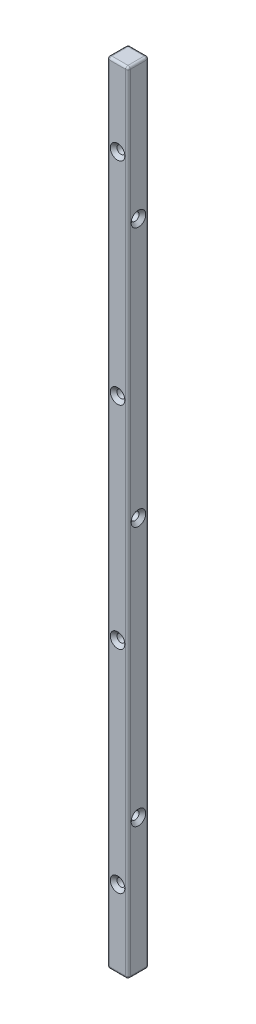
ISO-10303-21;
HEADER;
FILE_DESCRIPTION(('STEP AP214'),'2;1');
FILE_NAME('part.step','',(''),(''),'','','');
FILE_SCHEMA(('AUTOMOTIVE_DESIGN { 1 0 10303 214 1 1 1 1 }'));
ENDSEC;
DATA;
#1=APPLICATION_CONTEXT('core data for automotive mechanical design processes');
#2=APPLICATION_PROTOCOL_DEFINITION('international standard','automotive_design',2000,#1);
#3=PRODUCT_CONTEXT('',#1,'mechanical');
#4=PRODUCT('Part','Part','',(#3));
#5=PRODUCT_RELATED_PRODUCT_CATEGORY('part','',(#4));
#6=PRODUCT_DEFINITION_FORMATION('','',#4);
#7=PRODUCT_DEFINITION_CONTEXT('part definition',#1,'design');
#8=PRODUCT_DEFINITION('design','',#6,#7);
#9=PRODUCT_DEFINITION_SHAPE('','',#8);
#10=(LENGTH_UNIT() NAMED_UNIT(*) SI_UNIT(.MILLI.,.METRE.));
#11=(NAMED_UNIT(*) PLANE_ANGLE_UNIT() SI_UNIT($,.RADIAN.));
#12=(NAMED_UNIT(*) SI_UNIT($,.STERADIAN.) SOLID_ANGLE_UNIT());
#13=UNCERTAINTY_MEASURE_WITH_UNIT(LENGTH_MEASURE(1.E-05),#10,'distance_accuracy_value','');
#14=(GEOMETRIC_REPRESENTATION_CONTEXT(3) GLOBAL_UNCERTAINTY_ASSIGNED_CONTEXT((#13)) GLOBAL_UNIT_ASSIGNED_CONTEXT((#10,
#11,#12)) REPRESENTATION_CONTEXT('',''));
#15=CARTESIAN_POINT('',(0.,0.,0.));
#16=DIRECTION('',(0.,0.,1.));
#17=DIRECTION('',(1.,0.,0.));
#18=AXIS2_PLACEMENT_3D('',#15,#16,#17);
#19=CARTESIAN_POINT('',(4.5,340.5,4.5));
#20=DIRECTION('',(-1.,0.,0.));
#21=DIRECTION('',(0.,0.,1.));
#22=AXIS2_PLACEMENT_3D('',#19,#20,#21);
#23=PLANE('',#22);
#24=CARTESIAN_POINT('',(4.5,58.5,0.));
#25=DIRECTION('',(1.,0.,0.));
#26=DIRECTION('',(0.,0.,-1.));
#27=AXIS2_PLACEMENT_3D('',#24,#25,#26);
#28=CIRCLE('',#27,3.15);
#29=CARTESIAN_POINT('',(4.5,58.5,-3.15));
#30=VERTEX_POINT('',#29);
#31=EDGE_CURVE('E771',#30,#30,#28,.T.);
#32=ORIENTED_EDGE('',*,*,#31,.F.);
#33=EDGE_LOOP('',(#32));
#34=FACE_BOUND('',#33,.T.);
#35=CARTESIAN_POINT('',(4.5,170.25,0.));
#36=DIRECTION('',(1.,0.,0.));
#37=DIRECTION('',(0.,0.,-1.));
#38=AXIS2_PLACEMENT_3D('',#35,#36,#37);
#39=CIRCLE('',#38,3.14999999999999);
#40=CARTESIAN_POINT('',(4.5,170.25,-3.14999999999999));
#41=VERTEX_POINT('',#40);
#42=EDGE_CURVE('E764',#41,#41,#39,.T.);
#43=ORIENTED_EDGE('',*,*,#42,.F.);
#44=EDGE_LOOP('',(#43));
#45=FACE_BOUND('',#44,.T.);
#46=CARTESIAN_POINT('',(4.5,282.,0.));
#47=DIRECTION('',(1.,0.,0.));
#48=DIRECTION('',(0.,0.,-1.));
#49=AXIS2_PLACEMENT_3D('',#46,#47,#48);
#50=CIRCLE('',#49,3.14999999999999);
#51=CARTESIAN_POINT('',(4.5,282.,-3.14999999999999));
#52=VERTEX_POINT('',#51);
#53=EDGE_CURVE('E698',#52,#52,#50,.T.);
#54=ORIENTED_EDGE('',*,*,#53,.F.);
#55=EDGE_LOOP('',(#54));
#56=FACE_BOUND('',#55,.T.);
#57=DIRECTION('',(0.,-1.,0.));
#58=VECTOR('',#57,1.);
#59=CARTESIAN_POINT('',(4.5,340.5,-3.5));
#60=LINE('',#59,#58);
#61=CARTESIAN_POINT('',(4.5,1.,-3.5));
#62=VERTEX_POINT('',#61);
#63=CARTESIAN_POINT('',(4.5,339.5,-3.5));
#64=VERTEX_POINT('',#63);
#65=EDGE_CURVE('E131',#62,#64,#60,.F.);
#66=ORIENTED_EDGE('',*,*,#65,.T.);
#67=DIRECTION('',(0.,0.,-1.));
#68=VECTOR('',#67,1.);
#69=CARTESIAN_POINT('',(4.5,339.5,4.5));
#70=LINE('',#69,#68);
#71=CARTESIAN_POINT('',(4.5,339.5,3.5));
#72=VERTEX_POINT('',#71);
#73=EDGE_CURVE('E169',#64,#72,#70,.F.);
#74=ORIENTED_EDGE('',*,*,#73,.T.);
#75=DIRECTION('',(0.,-1.,0.));
#76=VECTOR('',#75,1.);
#77=CARTESIAN_POINT('',(4.5,340.5,3.5));
#78=LINE('',#77,#76);
#79=CARTESIAN_POINT('',(4.5,1.,3.5));
#80=VERTEX_POINT('',#79);
#81=EDGE_CURVE('E166',#72,#80,#78,.T.);
#82=ORIENTED_EDGE('',*,*,#81,.T.);
#83=DIRECTION('',(0.,0.,-1.));
#84=VECTOR('',#83,1.);
#85=CARTESIAN_POINT('',(4.5,1.,-4.5));
#86=LINE('',#85,#84);
#87=EDGE_CURVE('E161',#80,#62,#86,.T.);
#88=ORIENTED_EDGE('',*,*,#87,.T.);
#89=EDGE_LOOP('',(#66,#74,#82,#88));
#90=FACE_BOUND('',#89,.T.);
#91=ADVANCED_FACE('F36',(#34,#45,#56,#90),#23,.F.);
#92=CARTESIAN_POINT('',(-4.5,340.5,-4.5));
#93=DIRECTION('',(0.,0.,1.));
#94=DIRECTION('',(1.,0.,0.));
#95=AXIS2_PLACEMENT_3D('',#92,#93,#94);
#96=PLANE('',#95);
#97=CARTESIAN_POINT('',(0.,307.,-4.5));
#98=DIRECTION('',(0.,0.,1.));
#99=DIRECTION('',(1.,0.,0.));
#100=AXIS2_PLACEMENT_3D('',#97,#98,#99);
#101=CIRCLE('',#100,1.7);
#102=CARTESIAN_POINT('',(1.7,307.,-4.5));
#103=VERTEX_POINT('',#102);
#104=EDGE_CURVE('E704',#103,#103,#101,.T.);
#105=ORIENTED_EDGE('',*,*,#104,.T.);
#106=EDGE_LOOP('',(#105));
#107=FACE_BOUND('',#106,.T.);
#108=CARTESIAN_POINT('',(0.,215.833333333333,-4.5));
#109=DIRECTION('',(0.,0.,1.));
#110=DIRECTION('',(1.,0.,0.));
#111=AXIS2_PLACEMENT_3D('',#108,#109,#110);
#112=CIRCLE('',#111,1.7);
#113=CARTESIAN_POINT('',(1.7,215.833333333333,-4.5));
#114=VERTEX_POINT('',#113);
#115=EDGE_CURVE('E713',#114,#114,#112,.T.);
#116=ORIENTED_EDGE('',*,*,#115,.T.);
#117=EDGE_LOOP('',(#116));
#118=FACE_BOUND('',#117,.T.);
#119=CARTESIAN_POINT('',(0.,124.666666666667,-4.5));
#120=DIRECTION('',(0.,0.,1.));
#121=DIRECTION('',(1.,0.,0.));
#122=AXIS2_PLACEMENT_3D('',#119,#120,#121);
#123=CIRCLE('',#122,1.7);
#124=CARTESIAN_POINT('',(1.7,124.666666666667,-4.5));
#125=VERTEX_POINT('',#124);
#126=EDGE_CURVE('E722',#125,#125,#123,.T.);
#127=ORIENTED_EDGE('',*,*,#126,.T.);
#128=EDGE_LOOP('',(#127));
#129=FACE_BOUND('',#128,.T.);
#130=CARTESIAN_POINT('',(0.,33.5,-4.5));
#131=DIRECTION('',(0.,0.,1.));
#132=DIRECTION('',(1.,0.,0.));
#133=AXIS2_PLACEMENT_3D('',#130,#131,#132);
#134=CIRCLE('',#133,1.7);
#135=CARTESIAN_POINT('',(1.7,33.5,-4.5));
#136=VERTEX_POINT('',#135);
#137=EDGE_CURVE('E135',#136,#136,#134,.T.);
#138=ORIENTED_EDGE('',*,*,#137,.T.);
#139=EDGE_LOOP('',(#138));
#140=FACE_BOUND('',#139,.T.);
#141=DIRECTION('',(0.,-1.,0.));
#142=VECTOR('',#141,1.);
#143=CARTESIAN_POINT('',(-3.5,340.5,-4.5));
#144=LINE('',#143,#142);
#145=CARTESIAN_POINT('',(-3.5,1.,-4.5));
#146=VERTEX_POINT('',#145);
#147=CARTESIAN_POINT('',(-3.5,339.5,-4.5));
#148=VERTEX_POINT('',#147);
#149=EDGE_CURVE('E154',#146,#148,#144,.F.);
#150=ORIENTED_EDGE('',*,*,#149,.T.);
#151=DIRECTION('',(-1.,0.,0.));
#152=VECTOR('',#151,1.);
#153=CARTESIAN_POINT('',(-4.5,339.5,-4.5));
#154=LINE('',#153,#152);
#155=CARTESIAN_POINT('',(3.5,339.5,-4.5));
#156=VERTEX_POINT('',#155);
#157=EDGE_CURVE('E158',#148,#156,#154,.F.);
#158=ORIENTED_EDGE('',*,*,#157,.T.);
#159=DIRECTION('',(0.,-1.,0.));
#160=VECTOR('',#159,1.);
#161=CARTESIAN_POINT('',(3.5,340.5,-4.5));
#162=LINE('',#161,#160);
#163=CARTESIAN_POINT('',(3.5,1.,-4.5));
#164=VERTEX_POINT('',#163);
#165=EDGE_CURVE('E129',#156,#164,#162,.T.);
#166=ORIENTED_EDGE('',*,*,#165,.T.);
#167=DIRECTION('',(-1.,0.,0.));
#168=VECTOR('',#167,1.);
#169=CARTESIAN_POINT('',(-4.5,1.,-4.5));
#170=LINE('',#169,#168);
#171=EDGE_CURVE('E148',#164,#146,#170,.T.);
#172=ORIENTED_EDGE('',*,*,#171,.T.);
#173=EDGE_LOOP('',(#150,#158,#166,#172));
#174=FACE_BOUND('',#173,.T.);
#175=ADVANCED_FACE('F156',(#107,#118,#129,#140,#174),#96,.F.);
#176=CARTESIAN_POINT('',(-4.5,340.5,4.5));
#177=DIRECTION('',(1.,0.,0.));
#178=DIRECTION('',(0.,0.,-1.));
#179=AXIS2_PLACEMENT_3D('',#176,#177,#178);
#180=PLANE('',#179);
#181=CARTESIAN_POINT('',(-4.5,58.5,0.));
#182=DIRECTION('',(1.,0.,0.));
#183=DIRECTION('',(0.,0.,-1.));
#184=AXIS2_PLACEMENT_3D('',#181,#182,#183);
#185=CIRCLE('',#184,1.7);
#186=CARTESIAN_POINT('',(-4.5,58.5,-1.7));
#187=VERTEX_POINT('',#186);
#188=EDGE_CURVE('E683',#187,#187,#185,.T.);
#189=ORIENTED_EDGE('',*,*,#188,.T.);
#190=EDGE_LOOP('',(#189));
#191=FACE_BOUND('',#190,.T.);
#192=CARTESIAN_POINT('',(-4.5,170.25,0.));
#193=DIRECTION('',(1.,0.,0.));
#194=DIRECTION('',(0.,0.,-1.));
#195=AXIS2_PLACEMENT_3D('',#192,#193,#194);
#196=CIRCLE('',#195,1.70000000000001);
#197=CARTESIAN_POINT('',(-4.5,170.25,-1.70000000000001));
#198=VERTEX_POINT('',#197);
#199=EDGE_CURVE('E687',#198,#198,#196,.T.);
#200=ORIENTED_EDGE('',*,*,#199,.T.);
#201=EDGE_LOOP('',(#200));
#202=FACE_BOUND('',#201,.T.);
#203=CARTESIAN_POINT('',(-4.5,282.,0.));
#204=DIRECTION('',(1.,0.,0.));
#205=DIRECTION('',(0.,0.,-1.));
#206=AXIS2_PLACEMENT_3D('',#203,#204,#205);
#207=CIRCLE('',#206,1.69999999999998);
#208=CARTESIAN_POINT('',(-4.5,282.,-1.69999999999998));
#209=VERTEX_POINT('',#208);
#210=EDGE_CURVE('E690',#209,#209,#207,.T.);
#211=ORIENTED_EDGE('',*,*,#210,.T.);
#212=EDGE_LOOP('',(#211));
#213=FACE_BOUND('',#212,.T.);
#214=DIRECTION('',(0.,-1.,0.));
#215=VECTOR('',#214,1.);
#216=CARTESIAN_POINT('',(-4.5,340.5,3.5));
#217=LINE('',#216,#215);
#218=CARTESIAN_POINT('',(-4.5,1.,3.5));
#219=VERTEX_POINT('',#218);
#220=CARTESIAN_POINT('',(-4.5,339.5,3.5));
#221=VERTEX_POINT('',#220);
#222=EDGE_CURVE('E173',#219,#221,#217,.F.);
#223=ORIENTED_EDGE('',*,*,#222,.T.);
#224=DIRECTION('',(0.,0.,1.));
#225=VECTOR('',#224,1.);
#226=CARTESIAN_POINT('',(-4.5,339.5,4.5));
#227=LINE('',#226,#225);
#228=CARTESIAN_POINT('',(-4.5,339.5,-3.5));
#229=VERTEX_POINT('',#228);
#230=EDGE_CURVE('E178',#221,#229,#227,.F.);
#231=ORIENTED_EDGE('',*,*,#230,.T.);
#232=DIRECTION('',(0.,-1.,0.));
#233=VECTOR('',#232,1.);
#234=CARTESIAN_POINT('',(-4.5,340.5,-3.5));
#235=LINE('',#234,#233);
#236=CARTESIAN_POINT('',(-4.5,1.,-3.5));
#237=VERTEX_POINT('',#236);
#238=EDGE_CURVE('E175',#229,#237,#235,.T.);
#239=ORIENTED_EDGE('',*,*,#238,.T.);
#240=DIRECTION('',(0.,0.,1.));
#241=VECTOR('',#240,1.);
#242=CARTESIAN_POINT('',(-4.5,1.,4.5));
#243=LINE('',#242,#241);
#244=EDGE_CURVE('E171',#237,#219,#243,.T.);
#245=ORIENTED_EDGE('',*,*,#244,.T.);
#246=EDGE_LOOP('',(#223,#231,#239,#245));
#247=FACE_BOUND('',#246,.T.);
#248=ADVANCED_FACE('F283',(#191,#202,#213,#247),#180,.F.);
#249=CARTESIAN_POINT('',(-4.5,340.5,4.5));
#250=DIRECTION('',(0.,0.,-1.));
#251=DIRECTION('',(-1.,0.,0.));
#252=AXIS2_PLACEMENT_3D('',#249,#250,#251);
#253=PLANE('',#252);
#254=CARTESIAN_POINT('',(0.,307.,4.5));
#255=DIRECTION('',(0.,0.,1.));
#256=DIRECTION('',(1.,0.,0.));
#257=AXIS2_PLACEMENT_3D('',#254,#255,#256);
#258=CIRCLE('',#257,3.15);
#259=CARTESIAN_POINT('',(3.15,307.,4.5));
#260=VERTEX_POINT('',#259);
#261=EDGE_CURVE('E691',#260,#260,#258,.T.);
#262=ORIENTED_EDGE('',*,*,#261,.F.);
#263=EDGE_LOOP('',(#262));
#264=FACE_BOUND('',#263,.T.);
#265=CARTESIAN_POINT('',(0.,215.833333333333,4.5));
#266=DIRECTION('',(0.,0.,1.));
#267=DIRECTION('',(1.,0.,0.));
#268=AXIS2_PLACEMENT_3D('',#265,#266,#267);
#269=CIRCLE('',#268,3.15);
#270=CARTESIAN_POINT('',(3.15,215.833333333333,4.5));
#271=VERTEX_POINT('',#270);
#272=EDGE_CURVE('E707',#271,#271,#269,.T.);
#273=ORIENTED_EDGE('',*,*,#272,.F.);
#274=EDGE_LOOP('',(#273));
#275=FACE_BOUND('',#274,.T.);
#276=CARTESIAN_POINT('',(0.,124.666666666667,4.5));
#277=DIRECTION('',(0.,0.,1.));
#278=DIRECTION('',(1.,0.,0.));
#279=AXIS2_PLACEMENT_3D('',#276,#277,#278);
#280=CIRCLE('',#279,3.15);
#281=CARTESIAN_POINT('',(3.15,124.666666666667,4.5));
#282=VERTEX_POINT('',#281);
#283=EDGE_CURVE('E716',#282,#282,#280,.T.);
#284=ORIENTED_EDGE('',*,*,#283,.F.);
#285=EDGE_LOOP('',(#284));
#286=FACE_BOUND('',#285,.T.);
#287=CARTESIAN_POINT('',(0.,33.5,4.5));
#288=DIRECTION('',(0.,0.,1.));
#289=DIRECTION('',(1.,0.,0.));
#290=AXIS2_PLACEMENT_3D('',#287,#288,#289);
#291=CIRCLE('',#290,3.15);
#292=CARTESIAN_POINT('',(3.15,33.5,4.5));
#293=VERTEX_POINT('',#292);
#294=EDGE_CURVE('E725',#293,#293,#291,.T.);
#295=ORIENTED_EDGE('',*,*,#294,.F.);
#296=EDGE_LOOP('',(#295));
#297=FACE_BOUND('',#296,.T.);
#298=DIRECTION('',(0.,-1.,0.));
#299=VECTOR('',#298,1.);
#300=CARTESIAN_POINT('',(3.5,340.5,4.5));
#301=LINE('',#300,#299);
#302=CARTESIAN_POINT('',(3.5,1.,4.5));
#303=VERTEX_POINT('',#302);
#304=CARTESIAN_POINT('',(3.5,339.5,4.5));
#305=VERTEX_POINT('',#304);
#306=EDGE_CURVE('E182',#303,#305,#301,.F.);
#307=ORIENTED_EDGE('',*,*,#306,.T.);
#308=DIRECTION('',(1.,0.,0.));
#309=VECTOR('',#308,1.);
#310=CARTESIAN_POINT('',(-4.5,339.5,4.5));
#311=LINE('',#310,#309);
#312=CARTESIAN_POINT('',(-3.5,339.5,4.5));
#313=VERTEX_POINT('',#312);
#314=EDGE_CURVE('E187',#305,#313,#311,.F.);
#315=ORIENTED_EDGE('',*,*,#314,.T.);
#316=DIRECTION('',(0.,-1.,0.));
#317=VECTOR('',#316,1.);
#318=CARTESIAN_POINT('',(-3.5,340.5,4.5));
#319=LINE('',#318,#317);
#320=CARTESIAN_POINT('',(-3.5,1.,4.5));
#321=VERTEX_POINT('',#320);
#322=EDGE_CURVE('E184',#313,#321,#319,.T.);
#323=ORIENTED_EDGE('',*,*,#322,.T.);
#324=DIRECTION('',(1.,0.,0.));
#325=VECTOR('',#324,1.);
#326=CARTESIAN_POINT('',(4.5,1.,4.5));
#327=LINE('',#326,#325);
#328=EDGE_CURVE('E180',#321,#303,#327,.T.);
#329=ORIENTED_EDGE('',*,*,#328,.T.);
#330=EDGE_LOOP('',(#307,#315,#323,#329));
#331=FACE_BOUND('',#330,.T.);
#332=ADVANCED_FACE('F293',(#264,#275,#286,#297,#331),#253,.F.);
#333=CARTESIAN_POINT('',(4.5,340.5,-4.5));
#334=DIRECTION('',(0.,-1.,0.));
#335=DIRECTION('',(0.,0.,-1.));
#336=AXIS2_PLACEMENT_3D('',#333,#334,#335);
#337=PLANE('',#336);
#338=DIRECTION('',(0.,0.,1.));
#339=VECTOR('',#338,1.);
#340=CARTESIAN_POINT('',(-3.5,340.5,-4.5));
#341=LINE('',#340,#339);
#342=CARTESIAN_POINT('',(-3.5,340.5,-3.5));
#343=VERTEX_POINT('',#342);
#344=CARTESIAN_POINT('',(-3.5,340.5,3.5));
#345=VERTEX_POINT('',#344);
#346=EDGE_CURVE('E193',#343,#345,#341,.T.);
#347=ORIENTED_EDGE('',*,*,#346,.T.);
#348=DIRECTION('',(1.,0.,0.));
#349=VECTOR('',#348,1.);
#350=CARTESIAN_POINT('',(4.5,340.5,3.5));
#351=LINE('',#350,#349);
#352=CARTESIAN_POINT('',(3.5,340.5,3.5));
#353=VERTEX_POINT('',#352);
#354=EDGE_CURVE('E195',#345,#353,#351,.T.);
#355=ORIENTED_EDGE('',*,*,#354,.T.);
#356=DIRECTION('',(0.,0.,-1.));
#357=VECTOR('',#356,1.);
#358=CARTESIAN_POINT('',(3.5,340.5,-4.5));
#359=LINE('',#358,#357);
#360=CARTESIAN_POINT('',(3.5,340.5,-3.5));
#361=VERTEX_POINT('',#360);
#362=EDGE_CURVE('E189',#353,#361,#359,.T.);
#363=ORIENTED_EDGE('',*,*,#362,.T.);
#364=DIRECTION('',(-1.,0.,0.));
#365=VECTOR('',#364,1.);
#366=CARTESIAN_POINT('',(4.5,340.5,-3.5));
#367=LINE('',#366,#365);
#368=EDGE_CURVE('E191',#361,#343,#367,.T.);
#369=ORIENTED_EDGE('',*,*,#368,.T.);
#370=EDGE_LOOP('',(#347,#355,#363,#369));
#371=FACE_BOUND('',#370,.T.);
#372=ADVANCED_FACE('F275',(#371),#337,.F.);
#373=CARTESIAN_POINT('',(4.5,0.,-4.5));
#374=DIRECTION('',(0.,-1.,0.));
#375=DIRECTION('',(0.,0.,-1.));
#376=AXIS2_PLACEMENT_3D('',#373,#374,#375);
#377=PLANE('',#376);
#378=DIRECTION('',(0.,0.,-1.));
#379=VECTOR('',#378,1.);
#380=CARTESIAN_POINT('',(3.5,0.,4.5));
#381=LINE('',#380,#379);
#382=CARTESIAN_POINT('',(3.5,0.,-3.5));
#383=VERTEX_POINT('',#382);
#384=CARTESIAN_POINT('',(3.5,0.,3.5));
#385=VERTEX_POINT('',#384);
#386=EDGE_CURVE('E198',#383,#385,#381,.F.);
#387=ORIENTED_EDGE('',*,*,#386,.T.);
#388=DIRECTION('',(1.,0.,0.));
#389=VECTOR('',#388,1.);
#390=CARTESIAN_POINT('',(-4.5,0.,3.5));
#391=LINE('',#390,#389);
#392=CARTESIAN_POINT('',(-3.5,0.,3.5));
#393=VERTEX_POINT('',#392);
#394=EDGE_CURVE('E12',#385,#393,#391,.F.);
#395=ORIENTED_EDGE('',*,*,#394,.T.);
#396=DIRECTION('',(0.,0.,1.));
#397=VECTOR('',#396,1.);
#398=CARTESIAN_POINT('',(-3.5,0.,-4.5));
#399=LINE('',#398,#397);
#400=CARTESIAN_POINT('',(-3.5,0.,-3.5));
#401=VERTEX_POINT('',#400);
#402=EDGE_CURVE('E45',#393,#401,#399,.F.);
#403=ORIENTED_EDGE('',*,*,#402,.T.);
#404=DIRECTION('',(-1.,0.,0.));
#405=VECTOR('',#404,1.);
#406=CARTESIAN_POINT('',(4.5,0.,-3.5));
#407=LINE('',#406,#405);
#408=EDGE_CURVE('E200',#401,#383,#407,.F.);
#409=ORIENTED_EDGE('',*,*,#408,.T.);
#410=EDGE_LOOP('',(#387,#395,#403,#409));
#411=FACE_BOUND('',#410,.T.);
#412=ADVANCED_FACE('F627',(#411),#377,.T.);
#413=CARTESIAN_POINT('',(-3.5,340.5,3.5));
#414=DIRECTION('',(0.,-1.,0.));
#415=DIRECTION('',(0.,0.,-1.));
#416=AXIS2_PLACEMENT_3D('',#413,#414,#415);
#417=CYLINDRICAL_SURFACE('',#416,1.);
#418=CARTESIAN_POINT('',(-3.5,339.5,3.5));
#419=DIRECTION('',(0.,1.,0.));
#420=DIRECTION('',(0.,0.,1.));
#421=AXIS2_PLACEMENT_3D('',#418,#419,#420);
#422=CIRCLE('',#421,1.);
#423=EDGE_CURVE('E40',#221,#313,#422,.T.);
#424=ORIENTED_EDGE('',*,*,#423,.F.);
#425=ORIENTED_EDGE('',*,*,#222,.F.);
#426=CARTESIAN_POINT('',(-3.5,1.,3.5));
#427=DIRECTION('',(0.,-1.,0.));
#428=DIRECTION('',(0.,0.,-1.));
#429=AXIS2_PLACEMENT_3D('',#426,#427,#428);
#430=CIRCLE('',#429,1.);
#431=EDGE_CURVE('E253',#321,#219,#430,.T.);
#432=ORIENTED_EDGE('',*,*,#431,.F.);
#433=ORIENTED_EDGE('',*,*,#322,.F.);
#434=EDGE_LOOP('',(#424,#425,#432,#433));
#435=FACE_BOUND('',#434,.T.);
#436=ADVANCED_FACE('F38',(#435),#417,.T.);
#437=CARTESIAN_POINT('',(-3.5,339.5,3.5));
#438=DIRECTION('',(0.,0.,1.));
#439=DIRECTION('',(1.,0.,0.));
#440=AXIS2_PLACEMENT_3D('',#437,#438,#439);
#441=SPHERICAL_SURFACE('',#440,1.);
#442=CARTESIAN_POINT('',(-3.5,339.5,3.5));
#443=DIRECTION('',(0.,0.,1.));
#444=DIRECTION('',(1.,0.,0.));
#445=AXIS2_PLACEMENT_3D('',#442,#443,#444);
#446=CIRCLE('',#445,1.);
#447=EDGE_CURVE('E248',#221,#345,#446,.F.);
#448=ORIENTED_EDGE('',*,*,#447,.F.);
#449=ORIENTED_EDGE('',*,*,#423,.T.);
#450=CARTESIAN_POINT('',(-3.5,339.5,3.5));
#451=DIRECTION('',(-1.,0.,0.));
#452=DIRECTION('',(0.,-1.,0.));
#453=AXIS2_PLACEMENT_3D('',#450,#451,#452);
#454=CIRCLE('',#453,1.);
#455=EDGE_CURVE('E251',#345,#313,#454,.F.);
#456=ORIENTED_EDGE('',*,*,#455,.F.);
#457=EDGE_LOOP('',(#448,#449,#456));
#458=FACE_BOUND('',#457,.T.);
#459=ADVANCED_FACE('F263',(#458),#441,.T.);
#460=CARTESIAN_POINT('',(-3.5,1.,3.5));
#461=DIRECTION('',(0.,0.,1.));
#462=DIRECTION('',(1.,0.,0.));
#463=AXIS2_PLACEMENT_3D('',#460,#461,#462);
#464=SPHERICAL_SURFACE('',#463,1.);
#465=CARTESIAN_POINT('',(-3.5,1.,3.5));
#466=DIRECTION('',(-1.,0.,0.));
#467=DIRECTION('',(0.,0.,1.));
#468=AXIS2_PLACEMENT_3D('',#465,#466,#467);
#469=CIRCLE('',#468,1.);
#470=EDGE_CURVE('E243',#321,#393,#469,.F.);
#471=ORIENTED_EDGE('',*,*,#470,.F.);
#472=ORIENTED_EDGE('',*,*,#431,.T.);
#473=CARTESIAN_POINT('',(-3.5,1.,3.5));
#474=DIRECTION('',(0.,0.,1.));
#475=DIRECTION('',(1.,0.,0.));
#476=AXIS2_PLACEMENT_3D('',#473,#474,#475);
#477=CIRCLE('',#476,1.);
#478=EDGE_CURVE('E246',#393,#219,#477,.F.);
#479=ORIENTED_EDGE('',*,*,#478,.F.);
#480=EDGE_LOOP('',(#471,#472,#479));
#481=FACE_BOUND('',#480,.T.);
#482=ADVANCED_FACE('F606',(#481),#464,.T.);
#483=CARTESIAN_POINT('',(4.5,339.5,3.5));
#484=DIRECTION('',(1.,0.,0.));
#485=DIRECTION('',(0.,0.,-1.));
#486=AXIS2_PLACEMENT_3D('',#483,#484,#485);
#487=CYLINDRICAL_SURFACE('',#486,1.);
#488=ORIENTED_EDGE('',*,*,#455,.T.);
#489=ORIENTED_EDGE('',*,*,#314,.F.);
#490=CARTESIAN_POINT('',(3.5,339.5,3.5));
#491=DIRECTION('',(1.,0.,0.));
#492=DIRECTION('',(0.,0.,-1.));
#493=AXIS2_PLACEMENT_3D('',#490,#491,#492);
#494=CIRCLE('',#493,1.);
#495=EDGE_CURVE('E237',#353,#305,#494,.T.);
#496=ORIENTED_EDGE('',*,*,#495,.F.);
#497=ORIENTED_EDGE('',*,*,#354,.F.);
#498=EDGE_LOOP('',(#488,#489,#496,#497));
#499=FACE_BOUND('',#498,.T.);
#500=ADVANCED_FACE('F271',(#499),#487,.T.);
#501=CARTESIAN_POINT('',(-3.5,339.5,-4.5));
#502=DIRECTION('',(0.,0.,1.));
#503=DIRECTION('',(1.,0.,0.));
#504=AXIS2_PLACEMENT_3D('',#501,#502,#503);
#505=CYLINDRICAL_SURFACE('',#504,1.);
#506=ORIENTED_EDGE('',*,*,#447,.T.);
#507=ORIENTED_EDGE('',*,*,#346,.F.);
#508=CARTESIAN_POINT('',(-3.5,339.5,-3.5));
#509=DIRECTION('',(0.,0.,-1.));
#510=DIRECTION('',(0.,1.,0.));
#511=AXIS2_PLACEMENT_3D('',#508,#509,#510);
#512=CIRCLE('',#511,1.);
#513=EDGE_CURVE('E234',#229,#343,#512,.T.);
#514=ORIENTED_EDGE('',*,*,#513,.F.);
#515=ORIENTED_EDGE('',*,*,#230,.F.);
#516=EDGE_LOOP('',(#506,#507,#514,#515));
#517=FACE_BOUND('',#516,.T.);
#518=ADVANCED_FACE('F280',(#517),#505,.T.);
#519=CARTESIAN_POINT('',(-3.5,340.5,-3.5));
#520=DIRECTION('',(0.,-1.,0.));
#521=DIRECTION('',(0.,0.,-1.));
#522=AXIS2_PLACEMENT_3D('',#519,#520,#521);
#523=CYLINDRICAL_SURFACE('',#522,1.);
#524=CARTESIAN_POINT('',(-3.5,1.,-3.5));
#525=DIRECTION('',(0.,-1.,0.));
#526=DIRECTION('',(0.,0.,-1.));
#527=AXIS2_PLACEMENT_3D('',#524,#525,#526);
#528=CIRCLE('',#527,1.);
#529=EDGE_CURVE('E228',#237,#146,#528,.T.);
#530=ORIENTED_EDGE('',*,*,#529,.F.);
#531=ORIENTED_EDGE('',*,*,#238,.F.);
#532=CARTESIAN_POINT('',(-3.5,339.5,-3.5));
#533=DIRECTION('',(0.,1.,0.));
#534=DIRECTION('',(0.,0.,1.));
#535=AXIS2_PLACEMENT_3D('',#532,#533,#534);
#536=CIRCLE('',#535,1.);
#537=EDGE_CURVE('E231',#148,#229,#536,.T.);
#538=ORIENTED_EDGE('',*,*,#537,.F.);
#539=ORIENTED_EDGE('',*,*,#149,.F.);
#540=EDGE_LOOP('',(#530,#531,#538,#539));
#541=FACE_BOUND('',#540,.T.);
#542=ADVANCED_FACE('F287',(#541),#523,.T.);
#543=CARTESIAN_POINT('',(-3.5,1.,4.5));
#544=DIRECTION('',(0.,0.,-1.));
#545=DIRECTION('',(-1.,0.,0.));
#546=AXIS2_PLACEMENT_3D('',#543,#544,#545);
#547=CYLINDRICAL_SURFACE('',#546,1.);
#548=ORIENTED_EDGE('',*,*,#478,.T.);
#549=ORIENTED_EDGE('',*,*,#244,.F.);
#550=CARTESIAN_POINT('',(-3.5,1.,-3.5));
#551=DIRECTION('',(0.,0.,-1.));
#552=DIRECTION('',(-1.,0.,0.));
#553=AXIS2_PLACEMENT_3D('',#550,#551,#552);
#554=CIRCLE('',#553,1.);
#555=EDGE_CURVE('E226',#401,#237,#554,.T.);
#556=ORIENTED_EDGE('',*,*,#555,.F.);
#557=ORIENTED_EDGE('',*,*,#402,.F.);
#558=EDGE_LOOP('',(#548,#549,#556,#557));
#559=FACE_BOUND('',#558,.T.);
#560=ADVANCED_FACE('F291',(#559),#547,.T.);
#561=CARTESIAN_POINT('',(-4.5,1.,3.5));
#562=DIRECTION('',(-1.,0.,0.));
#563=DIRECTION('',(0.,0.,1.));
#564=AXIS2_PLACEMENT_3D('',#561,#562,#563);
#565=CYLINDRICAL_SURFACE('',#564,1.);
#566=ORIENTED_EDGE('',*,*,#470,.T.);
#567=ORIENTED_EDGE('',*,*,#394,.F.);
#568=CARTESIAN_POINT('',(3.5,1.,3.5));
#569=DIRECTION('',(1.,0.,0.));
#570=DIRECTION('',(0.,0.,-1.));
#571=AXIS2_PLACEMENT_3D('',#568,#569,#570);
#572=CIRCLE('',#571,1.);
#573=EDGE_CURVE('E223',#303,#385,#572,.T.);
#574=ORIENTED_EDGE('',*,*,#573,.F.);
#575=ORIENTED_EDGE('',*,*,#328,.F.);
#576=EDGE_LOOP('',(#566,#567,#574,#575));
#577=FACE_BOUND('',#576,.T.);
#578=ADVANCED_FACE('F303',(#577),#565,.T.);
#579=CARTESIAN_POINT('',(3.5,340.5,3.5));
#580=DIRECTION('',(0.,-1.,0.));
#581=DIRECTION('',(0.,0.,-1.));
#582=AXIS2_PLACEMENT_3D('',#579,#580,#581);
#583=CYLINDRICAL_SURFACE('',#582,1.);
#584=CARTESIAN_POINT('',(3.5,339.5,3.5));
#585=DIRECTION('',(0.,1.,0.));
#586=DIRECTION('',(0.,0.,1.));
#587=AXIS2_PLACEMENT_3D('',#584,#585,#586);
#588=CIRCLE('',#587,1.);
#589=EDGE_CURVE('E240',#305,#72,#588,.T.);
#590=ORIENTED_EDGE('',*,*,#589,.F.);
#591=ORIENTED_EDGE('',*,*,#306,.F.);
#592=CARTESIAN_POINT('',(3.5,1.,3.5));
#593=DIRECTION('',(0.,-1.,0.));
#594=DIRECTION('',(0.,0.,-1.));
#595=AXIS2_PLACEMENT_3D('',#592,#593,#594);
#596=CIRCLE('',#595,1.);
#597=EDGE_CURVE('E220',#80,#303,#596,.T.);
#598=ORIENTED_EDGE('',*,*,#597,.F.);
#599=ORIENTED_EDGE('',*,*,#81,.F.);
#600=EDGE_LOOP('',(#590,#591,#598,#599));
#601=FACE_BOUND('',#600,.T.);
#602=ADVANCED_FACE('F298',(#601),#583,.T.);
#603=CARTESIAN_POINT('',(3.5,339.5,3.5));
#604=DIRECTION('',(0.,0.,1.));
#605=DIRECTION('',(1.,0.,0.));
#606=AXIS2_PLACEMENT_3D('',#603,#604,#605);
#607=SPHERICAL_SURFACE('',#606,1.);
#608=ORIENTED_EDGE('',*,*,#495,.T.);
#609=ORIENTED_EDGE('',*,*,#589,.T.);
#610=CARTESIAN_POINT('',(3.5,339.5,3.5));
#611=DIRECTION('',(0.,0.,1.));
#612=DIRECTION('',(0.,-1.,0.));
#613=AXIS2_PLACEMENT_3D('',#610,#611,#612);
#614=CIRCLE('',#613,1.);
#615=EDGE_CURVE('E217',#353,#72,#614,.F.);
#616=ORIENTED_EDGE('',*,*,#615,.F.);
#617=EDGE_LOOP('',(#608,#609,#616));
#618=FACE_BOUND('',#617,.T.);
#619=ADVANCED_FACE('F314',(#618),#607,.T.);
#620=CARTESIAN_POINT('',(-3.5,339.5,-3.5));
#621=DIRECTION('',(0.,0.,1.));
#622=DIRECTION('',(1.,0.,0.));
#623=AXIS2_PLACEMENT_3D('',#620,#621,#622);
#624=SPHERICAL_SURFACE('',#623,1.);
#625=ORIENTED_EDGE('',*,*,#537,.T.);
#626=ORIENTED_EDGE('',*,*,#513,.T.);
#627=CARTESIAN_POINT('',(-3.5,339.5,-3.5));
#628=DIRECTION('',(-1.,0.,0.));
#629=DIRECTION('',(0.,0.,1.));
#630=AXIS2_PLACEMENT_3D('',#627,#628,#629);
#631=CIRCLE('',#630,1.);
#632=EDGE_CURVE('E214',#148,#343,#631,.F.);
#633=ORIENTED_EDGE('',*,*,#632,.F.);
#634=EDGE_LOOP('',(#625,#626,#633));
#635=FACE_BOUND('',#634,.T.);
#636=ADVANCED_FACE('F324',(#635),#624,.T.);
#637=CARTESIAN_POINT('',(-3.5,1.,-3.5));
#638=DIRECTION('',(0.,0.,1.));
#639=DIRECTION('',(1.,0.,0.));
#640=AXIS2_PLACEMENT_3D('',#637,#638,#639);
#641=SPHERICAL_SURFACE('',#640,1.);
#642=ORIENTED_EDGE('',*,*,#555,.T.);
#643=ORIENTED_EDGE('',*,*,#529,.T.);
#644=CARTESIAN_POINT('',(-3.5,1.,-3.5));
#645=DIRECTION('',(-1.,0.,0.));
#646=DIRECTION('',(0.,0.,1.));
#647=AXIS2_PLACEMENT_3D('',#644,#645,#646);
#648=CIRCLE('',#647,1.);
#649=EDGE_CURVE('E151',#401,#146,#648,.F.);
#650=ORIENTED_EDGE('',*,*,#649,.F.);
#651=EDGE_LOOP('',(#642,#643,#650));
#652=FACE_BOUND('',#651,.T.);
#653=ADVANCED_FACE('F326',(#652),#641,.T.);
#654=CARTESIAN_POINT('',(3.5,1.,3.5));
#655=DIRECTION('',(0.,0.,1.));
#656=DIRECTION('',(1.,0.,0.));
#657=AXIS2_PLACEMENT_3D('',#654,#655,#656);
#658=SPHERICAL_SURFACE('',#657,1.);
#659=ORIENTED_EDGE('',*,*,#597,.T.);
#660=ORIENTED_EDGE('',*,*,#573,.T.);
#661=CARTESIAN_POINT('',(3.5,1.,3.5));
#662=DIRECTION('',(0.,0.,1.));
#663=DIRECTION('',(1.,0.,0.));
#664=AXIS2_PLACEMENT_3D('',#661,#662,#663);
#665=CIRCLE('',#664,1.);
#666=EDGE_CURVE('E210',#80,#385,#665,.F.);
#667=ORIENTED_EDGE('',*,*,#666,.F.);
#668=EDGE_LOOP('',(#659,#660,#667));
#669=FACE_BOUND('',#668,.T.);
#670=ADVANCED_FACE('F305',(#669),#658,.T.);
#671=CARTESIAN_POINT('',(3.5,339.5,-4.5));
#672=DIRECTION('',(0.,0.,-1.));
#673=DIRECTION('',(-1.,0.,0.));
#674=AXIS2_PLACEMENT_3D('',#671,#672,#673);
#675=CYLINDRICAL_SURFACE('',#674,1.);
#676=ORIENTED_EDGE('',*,*,#615,.T.);
#677=ORIENTED_EDGE('',*,*,#73,.F.);
#678=CARTESIAN_POINT('',(3.5,339.5,-3.5));
#679=DIRECTION('',(0.,0.,-1.));
#680=DIRECTION('',(-1.,0.,0.));
#681=AXIS2_PLACEMENT_3D('',#678,#679,#680);
#682=CIRCLE('',#681,1.);
#683=EDGE_CURVE('E207',#361,#64,#682,.T.);
#684=ORIENTED_EDGE('',*,*,#683,.F.);
#685=ORIENTED_EDGE('',*,*,#362,.F.);
#686=EDGE_LOOP('',(#676,#677,#684,#685));
#687=FACE_BOUND('',#686,.T.);
#688=ADVANCED_FACE('F316',(#687),#675,.T.);
#689=CARTESIAN_POINT('',(4.5,339.5,-3.5));
#690=DIRECTION('',(-1.,0.,0.));
#691=DIRECTION('',(0.,0.,1.));
#692=AXIS2_PLACEMENT_3D('',#689,#690,#691);
#693=CYLINDRICAL_SURFACE('',#692,1.);
#694=ORIENTED_EDGE('',*,*,#632,.T.);
#695=ORIENTED_EDGE('',*,*,#368,.F.);
#696=CARTESIAN_POINT('',(3.5,339.5,-3.5));
#697=DIRECTION('',(1.,0.,0.));
#698=DIRECTION('',(0.,1.,0.));
#699=AXIS2_PLACEMENT_3D('',#696,#697,#698);
#700=CIRCLE('',#699,1.);
#701=EDGE_CURVE('E145',#156,#361,#700,.T.);
#702=ORIENTED_EDGE('',*,*,#701,.F.);
#703=ORIENTED_EDGE('',*,*,#157,.F.);
#704=EDGE_LOOP('',(#694,#695,#702,#703));
#705=FACE_BOUND('',#704,.T.);
#706=ADVANCED_FACE('F322',(#705),#693,.T.);
#707=CARTESIAN_POINT('',(-4.5,1.,-3.5));
#708=DIRECTION('',(1.,0.,0.));
#709=DIRECTION('',(0.,0.,-1.));
#710=AXIS2_PLACEMENT_3D('',#707,#708,#709);
#711=CYLINDRICAL_SURFACE('',#710,1.);
#712=ORIENTED_EDGE('',*,*,#649,.T.);
#713=ORIENTED_EDGE('',*,*,#171,.F.);
#714=CARTESIAN_POINT('',(3.5,1.,-3.5));
#715=DIRECTION('',(1.,0.,0.));
#716=DIRECTION('',(0.,0.,-1.));
#717=AXIS2_PLACEMENT_3D('',#714,#715,#716);
#718=CIRCLE('',#717,1.);
#719=EDGE_CURVE('E138',#383,#164,#718,.T.);
#720=ORIENTED_EDGE('',*,*,#719,.F.);
#721=ORIENTED_EDGE('',*,*,#408,.F.);
#722=EDGE_LOOP('',(#712,#713,#720,#721));
#723=FACE_BOUND('',#722,.T.);
#724=ADVANCED_FACE('F149',(#723),#711,.T.);
#725=CARTESIAN_POINT('',(3.5,1.,4.5));
#726=DIRECTION('',(0.,0.,1.));
#727=DIRECTION('',(1.,0.,0.));
#728=AXIS2_PLACEMENT_3D('',#725,#726,#727);
#729=CYLINDRICAL_SURFACE('',#728,1.);
#730=ORIENTED_EDGE('',*,*,#666,.T.);
#731=ORIENTED_EDGE('',*,*,#386,.F.);
#732=CARTESIAN_POINT('',(3.5,1.,-3.5));
#733=DIRECTION('',(0.,0.,-1.));
#734=DIRECTION('',(-1.,0.,0.));
#735=AXIS2_PLACEMENT_3D('',#732,#733,#734);
#736=CIRCLE('',#735,1.);
#737=EDGE_CURVE('E142',#62,#383,#736,.T.);
#738=ORIENTED_EDGE('',*,*,#737,.F.);
#739=ORIENTED_EDGE('',*,*,#87,.F.);
#740=EDGE_LOOP('',(#730,#731,#738,#739));
#741=FACE_BOUND('',#740,.T.);
#742=ADVANCED_FACE('F309',(#741),#729,.T.);
#743=CARTESIAN_POINT('',(3.5,339.5,-3.5));
#744=DIRECTION('',(0.,0.,1.));
#745=DIRECTION('',(1.,0.,0.));
#746=AXIS2_PLACEMENT_3D('',#743,#744,#745);
#747=SPHERICAL_SURFACE('',#746,1.);
#748=ORIENTED_EDGE('',*,*,#701,.T.);
#749=ORIENTED_EDGE('',*,*,#683,.T.);
#750=CARTESIAN_POINT('',(3.5,339.5,-3.5));
#751=DIRECTION('',(0.,1.,0.));
#752=DIRECTION('',(0.,0.,1.));
#753=AXIS2_PLACEMENT_3D('',#750,#751,#752);
#754=CIRCLE('',#753,1.);
#755=EDGE_CURVE('E134',#156,#64,#754,.F.);
#756=ORIENTED_EDGE('',*,*,#755,.F.);
#757=EDGE_LOOP('',(#748,#749,#756));
#758=FACE_BOUND('',#757,.T.);
#759=ADVANCED_FACE('F320',(#758),#747,.T.);
#760=CARTESIAN_POINT('',(3.5,1.,-3.5));
#761=DIRECTION('',(0.,0.,1.));
#762=DIRECTION('',(1.,0.,0.));
#763=AXIS2_PLACEMENT_3D('',#760,#761,#762);
#764=SPHERICAL_SURFACE('',#763,1.);
#765=ORIENTED_EDGE('',*,*,#737,.T.);
#766=ORIENTED_EDGE('',*,*,#719,.T.);
#767=CARTESIAN_POINT('',(3.5,1.,-3.5));
#768=DIRECTION('',(0.,-1.,0.));
#769=DIRECTION('',(0.,0.,-1.));
#770=AXIS2_PLACEMENT_3D('',#767,#768,#769);
#771=CIRCLE('',#770,1.);
#772=EDGE_CURVE('E125',#62,#164,#771,.F.);
#773=ORIENTED_EDGE('',*,*,#772,.F.);
#774=EDGE_LOOP('',(#765,#766,#773));
#775=FACE_BOUND('',#774,.T.);
#776=ADVANCED_FACE('F140',(#775),#764,.T.);
#777=CARTESIAN_POINT('',(3.5,340.5,-3.5));
#778=DIRECTION('',(0.,-1.,0.));
#779=DIRECTION('',(0.,0.,-1.));
#780=AXIS2_PLACEMENT_3D('',#777,#778,#779);
#781=CYLINDRICAL_SURFACE('',#780,1.);
#782=ORIENTED_EDGE('',*,*,#755,.T.);
#783=ORIENTED_EDGE('',*,*,#65,.F.);
#784=ORIENTED_EDGE('',*,*,#772,.T.);
#785=ORIENTED_EDGE('',*,*,#165,.F.);
#786=EDGE_LOOP('',(#782,#783,#784,#785));
#787=FACE_BOUND('',#786,.T.);
#788=ADVANCED_FACE('F127',(#787),#781,.T.);
#789=CARTESIAN_POINT('',(0.,33.5,4.5));
#790=DIRECTION('',(0.,0.,1.));
#791=DIRECTION('',(1.,0.,0.));
#792=AXIS2_PLACEMENT_3D('',#789,#790,#791);
#793=CYLINDRICAL_SURFACE('',#792,1.7);
#794=ORIENTED_EDGE('',*,*,#137,.F.);
#795=EDGE_LOOP('',(#794));
#796=FACE_BOUND('',#795,.T.);
#797=CARTESIAN_POINT('',(0.,33.5,3.05));
#798=DIRECTION('',(0.,0.,1.));
#799=DIRECTION('',(1.,0.,0.));
#800=AXIS2_PLACEMENT_3D('',#797,#798,#799);
#801=CIRCLE('',#800,1.7);
#802=CARTESIAN_POINT('',(1.7,33.5,3.05));
#803=VERTEX_POINT('',#802);
#804=EDGE_CURVE('E728',#803,#803,#801,.T.);
#805=ORIENTED_EDGE('',*,*,#804,.T.);
#806=EDGE_LOOP('',(#805));
#807=FACE_BOUND('',#806,.T.);
#808=ADVANCED_FACE('F348',(#796,#807),#793,.F.);
#809=CARTESIAN_POINT('',(0.,33.5,4.5));
#810=DIRECTION('',(0.,0.,1.));
#811=DIRECTION('',(1.,0.,0.));
#812=AXIS2_PLACEMENT_3D('',#809,#810,#811);
#813=CONICAL_SURFACE('',#812,3.15,0.785398163397448);
#814=ORIENTED_EDGE('',*,*,#804,.F.);
#815=EDGE_LOOP('',(#814));
#816=FACE_BOUND('',#815,.T.);
#817=ORIENTED_EDGE('',*,*,#294,.T.);
#818=EDGE_LOOP('',(#817));
#819=FACE_BOUND('',#818,.T.);
#820=ADVANCED_FACE('F400',(#816,#819),#813,.F.);
#821=CARTESIAN_POINT('',(0.,124.666666666667,4.5));
#822=DIRECTION('',(0.,0.,1.));
#823=DIRECTION('',(1.,0.,0.));
#824=AXIS2_PLACEMENT_3D('',#821,#822,#823);
#825=CYLINDRICAL_SURFACE('',#824,1.7);
#826=ORIENTED_EDGE('',*,*,#126,.F.);
#827=EDGE_LOOP('',(#826));
#828=FACE_BOUND('',#827,.T.);
#829=CARTESIAN_POINT('',(0.,124.666666666667,3.05));
#830=DIRECTION('',(0.,0.,1.));
#831=DIRECTION('',(1.,0.,0.));
#832=AXIS2_PLACEMENT_3D('',#829,#830,#831);
#833=CIRCLE('',#832,1.7);
#834=CARTESIAN_POINT('',(1.7,124.666666666667,3.05));
#835=VERTEX_POINT('',#834);
#836=EDGE_CURVE('E719',#835,#835,#833,.T.);
#837=ORIENTED_EDGE('',*,*,#836,.T.);
#838=EDGE_LOOP('',(#837));
#839=FACE_BOUND('',#838,.T.);
#840=ADVANCED_FACE('F409',(#828,#839),#825,.F.);
#841=CARTESIAN_POINT('',(0.,124.666666666667,4.5));
#842=DIRECTION('',(0.,0.,1.));
#843=DIRECTION('',(1.,0.,0.));
#844=AXIS2_PLACEMENT_3D('',#841,#842,#843);
#845=CONICAL_SURFACE('',#844,3.15,0.785398163397448);
#846=ORIENTED_EDGE('',*,*,#836,.F.);
#847=EDGE_LOOP('',(#846));
#848=FACE_BOUND('',#847,.T.);
#849=ORIENTED_EDGE('',*,*,#283,.T.);
#850=EDGE_LOOP('',(#849));
#851=FACE_BOUND('',#850,.T.);
#852=ADVANCED_FACE('F417',(#848,#851),#845,.F.);
#853=CARTESIAN_POINT('',(0.,215.833333333333,4.5));
#854=DIRECTION('',(0.,0.,1.));
#855=DIRECTION('',(1.,0.,0.));
#856=AXIS2_PLACEMENT_3D('',#853,#854,#855);
#857=CYLINDRICAL_SURFACE('',#856,1.7);
#858=ORIENTED_EDGE('',*,*,#115,.F.);
#859=EDGE_LOOP('',(#858));
#860=FACE_BOUND('',#859,.T.);
#861=CARTESIAN_POINT('',(0.,215.833333333333,3.05));
#862=DIRECTION('',(0.,0.,1.));
#863=DIRECTION('',(1.,0.,0.));
#864=AXIS2_PLACEMENT_3D('',#861,#862,#863);
#865=CIRCLE('',#864,1.7);
#866=CARTESIAN_POINT('',(1.7,215.833333333333,3.05));
#867=VERTEX_POINT('',#866);
#868=EDGE_CURVE('E710',#867,#867,#865,.T.);
#869=ORIENTED_EDGE('',*,*,#868,.T.);
#870=EDGE_LOOP('',(#869));
#871=FACE_BOUND('',#870,.T.);
#872=ADVANCED_FACE('F425',(#860,#871),#857,.F.);
#873=CARTESIAN_POINT('',(0.,215.833333333333,4.5));
#874=DIRECTION('',(0.,0.,1.));
#875=DIRECTION('',(1.,0.,0.));
#876=AXIS2_PLACEMENT_3D('',#873,#874,#875);
#877=CONICAL_SURFACE('',#876,3.15,0.785398163397448);
#878=ORIENTED_EDGE('',*,*,#868,.F.);
#879=EDGE_LOOP('',(#878));
#880=FACE_BOUND('',#879,.T.);
#881=ORIENTED_EDGE('',*,*,#272,.T.);
#882=EDGE_LOOP('',(#881));
#883=FACE_BOUND('',#882,.T.);
#884=ADVANCED_FACE('F433',(#880,#883),#877,.F.);
#885=CARTESIAN_POINT('',(0.,307.,4.5));
#886=DIRECTION('',(0.,0.,1.));
#887=DIRECTION('',(1.,0.,0.));
#888=AXIS2_PLACEMENT_3D('',#885,#886,#887);
#889=CYLINDRICAL_SURFACE('',#888,1.7);
#890=ORIENTED_EDGE('',*,*,#104,.F.);
#891=EDGE_LOOP('',(#890));
#892=FACE_BOUND('',#891,.T.);
#893=CARTESIAN_POINT('',(0.,307.,3.05));
#894=DIRECTION('',(0.,0.,1.));
#895=DIRECTION('',(1.,0.,0.));
#896=AXIS2_PLACEMENT_3D('',#893,#894,#895);
#897=CIRCLE('',#896,1.7);
#898=CARTESIAN_POINT('',(1.7,307.,3.05));
#899=VERTEX_POINT('',#898);
#900=EDGE_CURVE('E695',#899,#899,#897,.T.);
#901=ORIENTED_EDGE('',*,*,#900,.T.);
#902=EDGE_LOOP('',(#901));
#903=FACE_BOUND('',#902,.T.);
#904=ADVANCED_FACE('F441',(#892,#903),#889,.F.);
#905=CARTESIAN_POINT('',(0.,307.,4.5));
#906=DIRECTION('',(0.,0.,1.));
#907=DIRECTION('',(1.,0.,0.));
#908=AXIS2_PLACEMENT_3D('',#905,#906,#907);
#909=CONICAL_SURFACE('',#908,3.15,0.785398163397448);
#910=ORIENTED_EDGE('',*,*,#900,.F.);
#911=EDGE_LOOP('',(#910));
#912=FACE_BOUND('',#911,.T.);
#913=ORIENTED_EDGE('',*,*,#261,.T.);
#914=EDGE_LOOP('',(#913));
#915=FACE_BOUND('',#914,.T.);
#916=ADVANCED_FACE('F449',(#912,#915),#909,.F.);
#917=CARTESIAN_POINT('',(4.5,282.,0.));
#918=DIRECTION('',(1.,0.,0.));
#919=DIRECTION('',(0.,0.,-1.));
#920=AXIS2_PLACEMENT_3D('',#917,#918,#919);
#921=CYLINDRICAL_SURFACE('',#920,1.69999999999998);
#922=ORIENTED_EDGE('',*,*,#210,.F.);
#923=EDGE_LOOP('',(#922));
#924=FACE_BOUND('',#923,.T.);
#925=CARTESIAN_POINT('',(3.05,282.,0.));
#926=DIRECTION('',(1.,0.,0.));
#927=DIRECTION('',(0.,0.,-1.));
#928=AXIS2_PLACEMENT_3D('',#925,#926,#927);
#929=CIRCLE('',#928,1.69999999999998);
#930=CARTESIAN_POINT('',(3.05,282.,-1.69999999999998));
#931=VERTEX_POINT('',#930);
#932=EDGE_CURVE('E692',#931,#931,#929,.T.);
#933=ORIENTED_EDGE('',*,*,#932,.T.);
#934=EDGE_LOOP('',(#933));
#935=FACE_BOUND('',#934,.T.);
#936=ADVANCED_FACE('F457',(#924,#935),#921,.F.);
#937=CARTESIAN_POINT('',(4.5,282.,0.));
#938=DIRECTION('',(1.,0.,0.));
#939=DIRECTION('',(0.,0.,-1.));
#940=AXIS2_PLACEMENT_3D('',#937,#938,#939);
#941=CONICAL_SURFACE('',#940,3.14999999999999,0.78539816339745);
#942=ORIENTED_EDGE('',*,*,#932,.F.);
#943=EDGE_LOOP('',(#942));
#944=FACE_BOUND('',#943,.T.);
#945=ORIENTED_EDGE('',*,*,#53,.T.);
#946=EDGE_LOOP('',(#945));
#947=FACE_BOUND('',#946,.T.);
#948=ADVANCED_FACE('F465',(#944,#947),#941,.F.);
#949=CARTESIAN_POINT('',(4.5,170.25,0.));
#950=DIRECTION('',(1.,0.,0.));
#951=DIRECTION('',(0.,0.,-1.));
#952=AXIS2_PLACEMENT_3D('',#949,#950,#951);
#953=CYLINDRICAL_SURFACE('',#952,1.70000000000001);
#954=ORIENTED_EDGE('',*,*,#199,.F.);
#955=EDGE_LOOP('',(#954));
#956=FACE_BOUND('',#955,.T.);
#957=CARTESIAN_POINT('',(3.05,170.25,0.));
#958=DIRECTION('',(1.,0.,0.));
#959=DIRECTION('',(0.,0.,-1.));
#960=AXIS2_PLACEMENT_3D('',#957,#958,#959);
#961=CIRCLE('',#960,1.70000000000001);
#962=CARTESIAN_POINT('',(3.05,170.25,-1.70000000000001));
#963=VERTEX_POINT('',#962);
#964=EDGE_CURVE('E761',#963,#963,#961,.T.);
#965=ORIENTED_EDGE('',*,*,#964,.T.);
#966=EDGE_LOOP('',(#965));
#967=FACE_BOUND('',#966,.T.);
#968=ADVANCED_FACE('F473',(#956,#967),#953,.F.);
#969=CARTESIAN_POINT('',(4.5,170.25,0.));
#970=DIRECTION('',(1.,0.,0.));
#971=DIRECTION('',(0.,0.,-1.));
#972=AXIS2_PLACEMENT_3D('',#969,#970,#971);
#973=CONICAL_SURFACE('',#972,3.14999999999999,0.78539816339744);
#974=ORIENTED_EDGE('',*,*,#964,.F.);
#975=EDGE_LOOP('',(#974));
#976=FACE_BOUND('',#975,.T.);
#977=ORIENTED_EDGE('',*,*,#42,.T.);
#978=EDGE_LOOP('',(#977));
#979=FACE_BOUND('',#978,.T.);
#980=ADVANCED_FACE('F481',(#976,#979),#973,.F.);
#981=CARTESIAN_POINT('',(4.5,58.5,0.));
#982=DIRECTION('',(1.,0.,0.));
#983=DIRECTION('',(0.,0.,-1.));
#984=AXIS2_PLACEMENT_3D('',#981,#982,#983);
#985=CYLINDRICAL_SURFACE('',#984,1.7);
#986=ORIENTED_EDGE('',*,*,#188,.F.);
#987=EDGE_LOOP('',(#986));
#988=FACE_BOUND('',#987,.T.);
#989=CARTESIAN_POINT('',(3.05,58.5,0.));
#990=DIRECTION('',(1.,0.,0.));
#991=DIRECTION('',(0.,0.,-1.));
#992=AXIS2_PLACEMENT_3D('',#989,#990,#991);
#993=CIRCLE('',#992,1.7);
#994=CARTESIAN_POINT('',(3.05,58.5,-1.7));
#995=VERTEX_POINT('',#994);
#996=EDGE_CURVE('E768',#995,#995,#993,.T.);
#997=ORIENTED_EDGE('',*,*,#996,.T.);
#998=EDGE_LOOP('',(#997));
#999=FACE_BOUND('',#998,.T.);
#1000=ADVANCED_FACE('F489',(#988,#999),#985,.F.);
#1001=CARTESIAN_POINT('',(4.5,58.5,0.));
#1002=DIRECTION('',(1.,0.,0.));
#1003=DIRECTION('',(0.,0.,-1.));
#1004=AXIS2_PLACEMENT_3D('',#1001,#1002,#1003);
#1005=CONICAL_SURFACE('',#1004,3.15,0.785398163397447);
#1006=ORIENTED_EDGE('',*,*,#996,.F.);
#1007=EDGE_LOOP('',(#1006));
#1008=FACE_BOUND('',#1007,.T.);
#1009=ORIENTED_EDGE('',*,*,#31,.T.);
#1010=EDGE_LOOP('',(#1009));
#1011=FACE_BOUND('',#1010,.T.);
#1012=ADVANCED_FACE('F497',(#1008,#1011),#1005,.F.);
#1013=CLOSED_SHELL('',(#91,#175,#248,#332,#372,#412,#436,#459,#482,#500,#518,#542,#560,#578,
#602,#619,#636,#653,#670,#688,#706,#724,#742,#759,#776,#788,#808,#820,#840,#852,#872,#884,#904,
#916,#936,#948,#968,#980,#1000,#1012));
#1014=MANIFOLD_SOLID_BREP('B2',#1013);
#1015=ADVANCED_BREP_SHAPE_REPRESENTATION('',(#18,#1014),#14);
#1016=SHAPE_DEFINITION_REPRESENTATION(#9,#1015);
ENDSEC;
END-ISO-10303-21;
